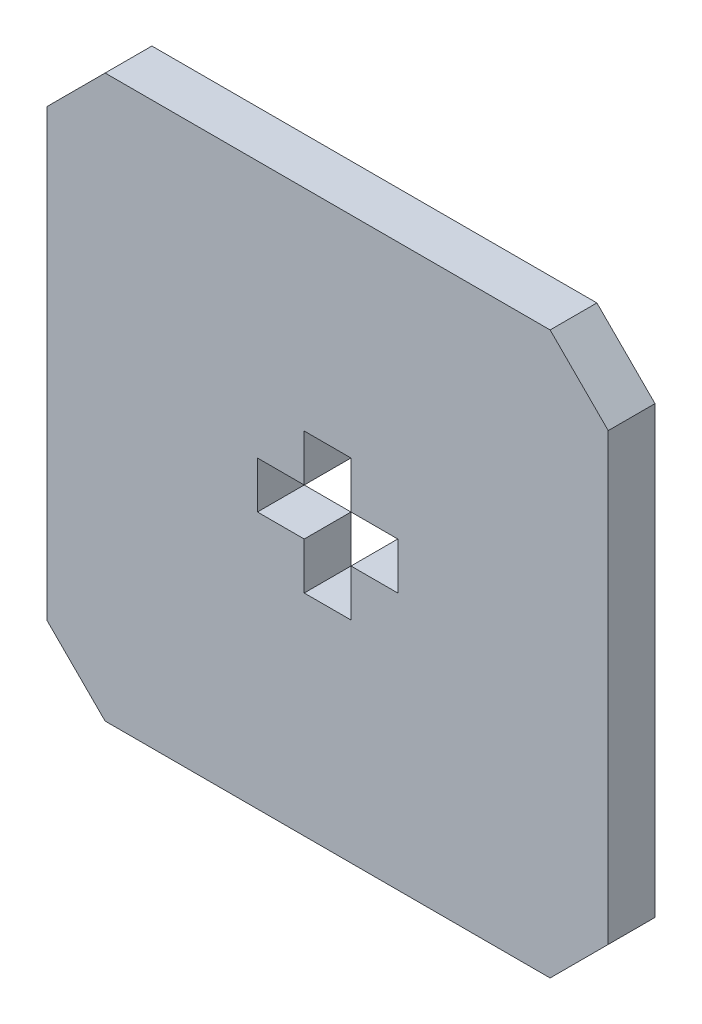
ISO-10303-21;
HEADER;
FILE_DESCRIPTION(('STEP AP214'),'2;1');
FILE_NAME('part.step','',(''),(''),'','','');
FILE_SCHEMA(('AUTOMOTIVE_DESIGN { 1 0 10303 214 1 1 1 1 }'));
ENDSEC;
DATA;
#1=APPLICATION_CONTEXT('core data for automotive mechanical design processes');
#2=APPLICATION_PROTOCOL_DEFINITION('international standard','automotive_design',2000,#1);
#3=PRODUCT_CONTEXT('',#1,'mechanical');
#4=PRODUCT('Part','Part','',(#3));
#5=PRODUCT_RELATED_PRODUCT_CATEGORY('part','',(#4));
#6=PRODUCT_DEFINITION_FORMATION('','',#4);
#7=PRODUCT_DEFINITION_CONTEXT('part definition',#1,'design');
#8=PRODUCT_DEFINITION('design','',#6,#7);
#9=PRODUCT_DEFINITION_SHAPE('','',#8);
#10=(LENGTH_UNIT() NAMED_UNIT(*) SI_UNIT(.MILLI.,.METRE.));
#11=(NAMED_UNIT(*) PLANE_ANGLE_UNIT() SI_UNIT($,.RADIAN.));
#12=(NAMED_UNIT(*) SI_UNIT($,.STERADIAN.) SOLID_ANGLE_UNIT());
#13=UNCERTAINTY_MEASURE_WITH_UNIT(LENGTH_MEASURE(1.E-05),#10,'distance_accuracy_value','');
#14=(GEOMETRIC_REPRESENTATION_CONTEXT(3) GLOBAL_UNCERTAINTY_ASSIGNED_CONTEXT((#13)) GLOBAL_UNIT_ASSIGNED_CONTEXT((#10,
#11,#12)) REPRESENTATION_CONTEXT('',''));
#15=CARTESIAN_POINT('',(0.,0.,0.));
#16=DIRECTION('',(0.,0.,1.));
#17=DIRECTION('',(1.,0.,0.));
#18=AXIS2_PLACEMENT_3D('',#15,#16,#17);
#19=CARTESIAN_POINT('',(0.,0.,3.));
#20=DIRECTION('',(0.,0.,1.));
#21=DIRECTION('',(1.,0.,0.));
#22=AXIS2_PLACEMENT_3D('',#19,#20,#21);
#23=PLANE('',#22);
#24=DIRECTION('',(0.,1.,0.));
#25=VECTOR('',#24,1.);
#26=CARTESIAN_POINT('',(471.000004860086,264.727917271616,3.));
#27=LINE('',#26,#25);
#28=CARTESIAN_POINT('',(471.000004860086,264.727917271616,3.));
#29=VERTEX_POINT('',#28);
#30=CARTESIAN_POINT('',(471.000004860086,293.272073148816,3.));
#31=VERTEX_POINT('',#30);
#32=EDGE_CURVE('E264',#29,#31,#27,.T.);
#33=ORIENTED_EDGE('',*,*,#32,.T.);
#34=DIRECTION('',(-0.707106781186548,0.707106781186548,0.));
#35=VECTOR('',#34,1.);
#36=CARTESIAN_POINT('',(471.000004860086,293.272073148816,3.));
#37=LINE('',#36,#35);
#38=CARTESIAN_POINT('',(467.272082798686,296.999995210216,3.));
#39=VERTEX_POINT('',#38);
#40=EDGE_CURVE('E267',#31,#39,#37,.T.);
#41=ORIENTED_EDGE('',*,*,#40,.T.);
#42=DIRECTION('',(-1.,0.,0.));
#43=VECTOR('',#42,1.);
#44=CARTESIAN_POINT('',(467.272082798686,296.999995210216,3.));
#45=LINE('',#44,#43);
#46=CARTESIAN_POINT('',(438.727926921486,296.999995210216,3.));
#47=VERTEX_POINT('',#46);
#48=EDGE_CURVE('E270',#39,#47,#45,.T.);
#49=ORIENTED_EDGE('',*,*,#48,.T.);
#50=DIRECTION('',(-0.707106781186548,-0.707106781186548,0.));
#51=VECTOR('',#50,1.);
#52=CARTESIAN_POINT('',(438.727926921486,296.999995210216,3.));
#53=LINE('',#52,#51);
#54=CARTESIAN_POINT('',(435.000004860086,293.272073148816,3.));
#55=VERTEX_POINT('',#54);
#56=EDGE_CURVE('E272',#47,#55,#53,.T.);
#57=ORIENTED_EDGE('',*,*,#56,.T.);
#58=DIRECTION('',(0.,-1.,0.));
#59=VECTOR('',#58,1.);
#60=CARTESIAN_POINT('',(435.000004860086,293.272073148816,3.));
#61=LINE('',#60,#59);
#62=CARTESIAN_POINT('',(435.000004860086,264.727917271616,3.));
#63=VERTEX_POINT('',#62);
#64=EDGE_CURVE('E274',#55,#63,#61,.T.);
#65=ORIENTED_EDGE('',*,*,#64,.T.);
#66=DIRECTION('',(0.707106781186548,-0.707106781186548,0.));
#67=VECTOR('',#66,1.);
#68=CARTESIAN_POINT('',(435.000004860086,264.727917271616,3.));
#69=LINE('',#68,#67);
#70=CARTESIAN_POINT('',(438.727926921486,260.999995210216,3.));
#71=VERTEX_POINT('',#70);
#72=EDGE_CURVE('E276',#63,#71,#69,.T.);
#73=ORIENTED_EDGE('',*,*,#72,.T.);
#74=DIRECTION('',(1.,0.,0.));
#75=VECTOR('',#74,1.);
#76=CARTESIAN_POINT('',(438.727926921486,260.999995210216,3.));
#77=LINE('',#76,#75);
#78=CARTESIAN_POINT('',(467.272082798686,260.999995210216,3.));
#79=VERTEX_POINT('',#78);
#80=EDGE_CURVE('E278',#71,#79,#77,.T.);
#81=ORIENTED_EDGE('',*,*,#80,.T.);
#82=DIRECTION('',(0.707106781186548,0.707106781186548,0.));
#83=VECTOR('',#82,1.);
#84=CARTESIAN_POINT('',(467.272082798686,260.999995210216,3.));
#85=LINE('',#84,#83);
#86=EDGE_CURVE('E280',#79,#29,#85,.T.);
#87=ORIENTED_EDGE('',*,*,#86,.T.);
#88=EDGE_LOOP('',(#33,#41,#49,#57,#65,#73,#81,#87));
#89=FACE_BOUND('',#88,.T.);
#90=DIRECTION('',(0.,1.,0.));
#91=VECTOR('',#90,1.);
#92=CARTESIAN_POINT('',(454.500004860086,274.499995210216,3.));
#93=LINE('',#92,#91);
#94=CARTESIAN_POINT('',(454.500004860086,274.499995210216,3.));
#95=VERTEX_POINT('',#94);
#96=CARTESIAN_POINT('',(454.500004860086,277.499995210216,3.));
#97=VERTEX_POINT('',#96);
#98=EDGE_CURVE('E179',#95,#97,#93,.T.);
#99=ORIENTED_EDGE('',*,*,#98,.F.);
#100=DIRECTION('',(1.,0.,0.));
#101=VECTOR('',#100,1.);
#102=CARTESIAN_POINT('',(451.500004860086,274.499995210216,3.));
#103=LINE('',#102,#101);
#104=CARTESIAN_POINT('',(451.500004860086,274.499995210216,3.));
#105=VERTEX_POINT('',#104);
#106=EDGE_CURVE('E171',#105,#95,#103,.T.);
#107=ORIENTED_EDGE('',*,*,#106,.F.);
#108=DIRECTION('',(0.,-1.,0.));
#109=VECTOR('',#108,1.);
#110=CARTESIAN_POINT('',(451.500004860086,277.499995210216,3.));
#111=LINE('',#110,#109);
#112=CARTESIAN_POINT('',(451.500004860086,277.499995210216,3.));
#113=VERTEX_POINT('',#112);
#114=EDGE_CURVE('E212',#113,#105,#111,.T.);
#115=ORIENTED_EDGE('',*,*,#114,.F.);
#116=DIRECTION('',(1.,0.,0.));
#117=VECTOR('',#116,1.);
#118=CARTESIAN_POINT('',(448.500004860086,277.499995210216,3.));
#119=LINE('',#118,#117);
#120=CARTESIAN_POINT('',(448.500004860086,277.499995210216,3.));
#121=VERTEX_POINT('',#120);
#122=EDGE_CURVE('E210',#121,#113,#119,.T.);
#123=ORIENTED_EDGE('',*,*,#122,.F.);
#124=DIRECTION('',(0.,-1.,0.));
#125=VECTOR('',#124,1.);
#126=CARTESIAN_POINT('',(448.500004860086,280.499995210216,3.));
#127=LINE('',#126,#125);
#128=CARTESIAN_POINT('',(448.500004860086,280.499995210216,3.));
#129=VERTEX_POINT('',#128);
#130=EDGE_CURVE('E208',#129,#121,#127,.T.);
#131=ORIENTED_EDGE('',*,*,#130,.F.);
#132=DIRECTION('',(-1.,0.,0.));
#133=VECTOR('',#132,1.);
#134=CARTESIAN_POINT('',(451.500004860086,280.499995210216,3.));
#135=LINE('',#134,#133);
#136=CARTESIAN_POINT('',(451.500004860086,280.499995210216,3.));
#137=VERTEX_POINT('',#136);
#138=EDGE_CURVE('E206',#137,#129,#135,.T.);
#139=ORIENTED_EDGE('',*,*,#138,.F.);
#140=DIRECTION('',(0.,-1.,0.));
#141=VECTOR('',#140,1.);
#142=CARTESIAN_POINT('',(451.500004860086,283.499995210216,3.));
#143=LINE('',#142,#141);
#144=CARTESIAN_POINT('',(451.500004860086,283.499995210216,3.));
#145=VERTEX_POINT('',#144);
#146=EDGE_CURVE('E204',#145,#137,#143,.T.);
#147=ORIENTED_EDGE('',*,*,#146,.F.);
#148=DIRECTION('',(-1.,0.,0.));
#149=VECTOR('',#148,1.);
#150=CARTESIAN_POINT('',(454.500004860086,283.499995210216,3.));
#151=LINE('',#150,#149);
#152=CARTESIAN_POINT('',(454.500004860086,283.499995210216,3.));
#153=VERTEX_POINT('',#152);
#154=EDGE_CURVE('E202',#153,#145,#151,.T.);
#155=ORIENTED_EDGE('',*,*,#154,.F.);
#156=DIRECTION('',(0.,1.,0.));
#157=VECTOR('',#156,1.);
#158=CARTESIAN_POINT('',(454.500004860086,280.499995210216,3.));
#159=LINE('',#158,#157);
#160=CARTESIAN_POINT('',(454.500004860086,280.499995210216,3.));
#161=VERTEX_POINT('',#160);
#162=EDGE_CURVE('E200',#161,#153,#159,.T.);
#163=ORIENTED_EDGE('',*,*,#162,.F.);
#164=DIRECTION('',(-1.,0.,0.));
#165=VECTOR('',#164,1.);
#166=CARTESIAN_POINT('',(457.500004860086,280.499995210216,3.));
#167=LINE('',#166,#165);
#168=CARTESIAN_POINT('',(457.500004860086,280.499995210216,3.));
#169=VERTEX_POINT('',#168);
#170=EDGE_CURVE('E198',#169,#161,#167,.T.);
#171=ORIENTED_EDGE('',*,*,#170,.F.);
#172=DIRECTION('',(0.,1.,0.));
#173=VECTOR('',#172,1.);
#174=CARTESIAN_POINT('',(457.500004860086,277.499995210216,3.));
#175=LINE('',#174,#173);
#176=CARTESIAN_POINT('',(457.500004860086,277.499995210216,3.));
#177=VERTEX_POINT('',#176);
#178=EDGE_CURVE('E194',#177,#169,#175,.T.);
#179=ORIENTED_EDGE('',*,*,#178,.F.);
#180=DIRECTION('',(1.,0.,0.));
#181=VECTOR('',#180,1.);
#182=CARTESIAN_POINT('',(454.500004860086,277.499995210216,3.));
#183=LINE('',#182,#181);
#184=EDGE_CURVE('E192',#97,#177,#183,.T.);
#185=ORIENTED_EDGE('',*,*,#184,.F.);
#186=EDGE_LOOP('',(#99,#107,#115,#123,#131,#139,#147,#155,#163,#171,#179,#185));
#187=FACE_BOUND('',#186,.T.);
#188=ADVANCED_FACE('F34',(#89,#187),#23,.T.);
#189=CARTESIAN_POINT('',(0.,0.,0.));
#190=DIRECTION('',(0.,0.,1.));
#191=DIRECTION('',(1.,0.,0.));
#192=AXIS2_PLACEMENT_3D('',#189,#190,#191);
#193=PLANE('',#192);
#194=DIRECTION('',(0.,1.,0.));
#195=VECTOR('',#194,1.);
#196=CARTESIAN_POINT('',(471.000004860086,264.727917271616,0.));
#197=LINE('',#196,#195);
#198=CARTESIAN_POINT('',(471.000004860086,264.727917271616,0.));
#199=VERTEX_POINT('',#198);
#200=CARTESIAN_POINT('',(471.000004860086,293.272073148816,0.));
#201=VERTEX_POINT('',#200);
#202=EDGE_CURVE('E187',#199,#201,#197,.T.);
#203=ORIENTED_EDGE('',*,*,#202,.F.);
#204=DIRECTION('',(0.707106781186548,0.707106781186548,0.));
#205=VECTOR('',#204,1.);
#206=CARTESIAN_POINT('',(467.272082798686,260.999995210216,0.));
#207=LINE('',#206,#205);
#208=CARTESIAN_POINT('',(467.272082798686,260.999995210216,0.));
#209=VERTEX_POINT('',#208);
#210=EDGE_CURVE('E268',#209,#199,#207,.T.);
#211=ORIENTED_EDGE('',*,*,#210,.F.);
#212=DIRECTION('',(1.,0.,0.));
#213=VECTOR('',#212,1.);
#214=CARTESIAN_POINT('',(438.727926921486,260.999995210216,0.));
#215=LINE('',#214,#213);
#216=CARTESIAN_POINT('',(438.727926921486,260.999995210216,0.));
#217=VERTEX_POINT('',#216);
#218=EDGE_CURVE('E295',#217,#209,#215,.T.);
#219=ORIENTED_EDGE('',*,*,#218,.F.);
#220=DIRECTION('',(0.707106781186548,-0.707106781186548,0.));
#221=VECTOR('',#220,1.);
#222=CARTESIAN_POINT('',(435.000004860086,264.727917271616,0.));
#223=LINE('',#222,#221);
#224=CARTESIAN_POINT('',(435.000004860086,264.727917271616,0.));
#225=VERTEX_POINT('',#224);
#226=EDGE_CURVE('E293',#225,#217,#223,.T.);
#227=ORIENTED_EDGE('',*,*,#226,.F.);
#228=DIRECTION('',(0.,-1.,0.));
#229=VECTOR('',#228,1.);
#230=CARTESIAN_POINT('',(435.000004860086,293.272073148816,0.));
#231=LINE('',#230,#229);
#232=CARTESIAN_POINT('',(435.000004860086,293.272073148816,0.));
#233=VERTEX_POINT('',#232);
#234=EDGE_CURVE('E291',#233,#225,#231,.T.);
#235=ORIENTED_EDGE('',*,*,#234,.F.);
#236=DIRECTION('',(-0.707106781186548,-0.707106781186548,0.));
#237=VECTOR('',#236,1.);
#238=CARTESIAN_POINT('',(438.727926921486,296.999995210216,0.));
#239=LINE('',#238,#237);
#240=CARTESIAN_POINT('',(438.727926921486,296.999995210216,0.));
#241=VERTEX_POINT('',#240);
#242=EDGE_CURVE('E289',#241,#233,#239,.T.);
#243=ORIENTED_EDGE('',*,*,#242,.F.);
#244=DIRECTION('',(-1.,0.,0.));
#245=VECTOR('',#244,1.);
#246=CARTESIAN_POINT('',(467.272082798686,296.999995210216,0.));
#247=LINE('',#246,#245);
#248=CARTESIAN_POINT('',(467.272082798686,296.999995210216,0.));
#249=VERTEX_POINT('',#248);
#250=EDGE_CURVE('E287',#249,#241,#247,.T.);
#251=ORIENTED_EDGE('',*,*,#250,.F.);
#252=DIRECTION('',(-0.707106781186548,0.707106781186548,0.));
#253=VECTOR('',#252,1.);
#254=CARTESIAN_POINT('',(471.000004860086,293.272073148816,0.));
#255=LINE('',#254,#253);
#256=EDGE_CURVE('E285',#201,#249,#255,.T.);
#257=ORIENTED_EDGE('',*,*,#256,.F.);
#258=EDGE_LOOP('',(#203,#211,#219,#227,#235,#243,#251,#257));
#259=FACE_BOUND('',#258,.T.);
#260=DIRECTION('',(1.,0.,0.));
#261=VECTOR('',#260,1.);
#262=CARTESIAN_POINT('',(451.500004860086,274.499995210216,0.));
#263=LINE('',#262,#261);
#264=CARTESIAN_POINT('',(451.500004860086,274.499995210216,0.));
#265=VERTEX_POINT('',#264);
#266=CARTESIAN_POINT('',(454.500004860086,274.499995210216,0.));
#267=VERTEX_POINT('',#266);
#268=EDGE_CURVE('E57',#265,#267,#263,.T.);
#269=ORIENTED_EDGE('',*,*,#268,.T.);
#270=DIRECTION('',(0.,1.,0.));
#271=VECTOR('',#270,1.);
#272=CARTESIAN_POINT('',(454.500004860086,274.499995210216,0.));
#273=LINE('',#272,#271);
#274=CARTESIAN_POINT('',(454.500004860086,277.499995210216,0.));
#275=VERTEX_POINT('',#274);
#276=EDGE_CURVE('E186',#267,#275,#273,.T.);
#277=ORIENTED_EDGE('',*,*,#276,.T.);
#278=DIRECTION('',(1.,0.,0.));
#279=VECTOR('',#278,1.);
#280=CARTESIAN_POINT('',(454.500004860086,277.499995210216,0.));
#281=LINE('',#280,#279);
#282=CARTESIAN_POINT('',(457.500004860086,277.499995210216,0.));
#283=VERTEX_POINT('',#282);
#284=EDGE_CURVE('E216',#275,#283,#281,.T.);
#285=ORIENTED_EDGE('',*,*,#284,.T.);
#286=DIRECTION('',(0.,1.,0.));
#287=VECTOR('',#286,1.);
#288=CARTESIAN_POINT('',(457.500004860086,277.499995210216,0.));
#289=LINE('',#288,#287);
#290=CARTESIAN_POINT('',(457.500004860086,280.499995210216,0.));
#291=VERTEX_POINT('',#290);
#292=EDGE_CURVE('E219',#283,#291,#289,.T.);
#293=ORIENTED_EDGE('',*,*,#292,.T.);
#294=DIRECTION('',(-1.,0.,0.));
#295=VECTOR('',#294,1.);
#296=CARTESIAN_POINT('',(457.500004860086,280.499995210216,0.));
#297=LINE('',#296,#295);
#298=CARTESIAN_POINT('',(454.500004860086,280.499995210216,0.));
#299=VERTEX_POINT('',#298);
#300=EDGE_CURVE('E222',#291,#299,#297,.T.);
#301=ORIENTED_EDGE('',*,*,#300,.T.);
#302=DIRECTION('',(0.,1.,0.));
#303=VECTOR('',#302,1.);
#304=CARTESIAN_POINT('',(454.500004860086,280.499995210216,0.));
#305=LINE('',#304,#303);
#306=CARTESIAN_POINT('',(454.500004860086,283.499995210216,0.));
#307=VERTEX_POINT('',#306);
#308=EDGE_CURVE('E225',#299,#307,#305,.T.);
#309=ORIENTED_EDGE('',*,*,#308,.T.);
#310=DIRECTION('',(-1.,0.,0.));
#311=VECTOR('',#310,1.);
#312=CARTESIAN_POINT('',(454.500004860086,283.499995210216,0.));
#313=LINE('',#312,#311);
#314=CARTESIAN_POINT('',(451.500004860086,283.499995210216,0.));
#315=VERTEX_POINT('',#314);
#316=EDGE_CURVE('E228',#307,#315,#313,.T.);
#317=ORIENTED_EDGE('',*,*,#316,.T.);
#318=DIRECTION('',(0.,-1.,0.));
#319=VECTOR('',#318,1.);
#320=CARTESIAN_POINT('',(451.500004860086,283.499995210216,0.));
#321=LINE('',#320,#319);
#322=CARTESIAN_POINT('',(451.500004860086,280.499995210216,0.));
#323=VERTEX_POINT('',#322);
#324=EDGE_CURVE('E231',#315,#323,#321,.T.);
#325=ORIENTED_EDGE('',*,*,#324,.T.);
#326=DIRECTION('',(-1.,0.,0.));
#327=VECTOR('',#326,1.);
#328=CARTESIAN_POINT('',(451.500004860086,280.499995210216,0.));
#329=LINE('',#328,#327);
#330=CARTESIAN_POINT('',(448.500004860086,280.499995210216,0.));
#331=VERTEX_POINT('',#330);
#332=EDGE_CURVE('E234',#323,#331,#329,.T.);
#333=ORIENTED_EDGE('',*,*,#332,.T.);
#334=DIRECTION('',(0.,-1.,0.));
#335=VECTOR('',#334,1.);
#336=CARTESIAN_POINT('',(448.500004860086,280.499995210216,0.));
#337=LINE('',#336,#335);
#338=CARTESIAN_POINT('',(448.500004860086,277.499995210216,0.));
#339=VERTEX_POINT('',#338);
#340=EDGE_CURVE('E237',#331,#339,#337,.T.);
#341=ORIENTED_EDGE('',*,*,#340,.T.);
#342=DIRECTION('',(1.,0.,0.));
#343=VECTOR('',#342,1.);
#344=CARTESIAN_POINT('',(448.500004860086,277.499995210216,0.));
#345=LINE('',#344,#343);
#346=CARTESIAN_POINT('',(451.500004860086,277.499995210216,0.));
#347=VERTEX_POINT('',#346);
#348=EDGE_CURVE('E240',#339,#347,#345,.T.);
#349=ORIENTED_EDGE('',*,*,#348,.T.);
#350=DIRECTION('',(0.,-1.,0.));
#351=VECTOR('',#350,1.);
#352=CARTESIAN_POINT('',(451.500004860086,277.499995210216,0.));
#353=LINE('',#352,#351);
#354=EDGE_CURVE('E180',#347,#265,#353,.T.);
#355=ORIENTED_EDGE('',*,*,#354,.T.);
#356=EDGE_LOOP('',(#269,#277,#285,#293,#301,#309,#317,#325,#333,#341,#349,#355));
#357=FACE_BOUND('',#356,.T.);
#358=ADVANCED_FACE('F325',(#259,#357),#193,.F.);
#359=CARTESIAN_POINT('',(471.000004860086,264.727917271616,3.));
#360=DIRECTION('',(-1.,0.,0.));
#361=DIRECTION('',(0.,0.,1.));
#362=AXIS2_PLACEMENT_3D('',#359,#360,#361);
#363=PLANE('',#362);
#364=ORIENTED_EDGE('',*,*,#202,.T.);
#365=DIRECTION('',(0.,0.,-1.));
#366=VECTOR('',#365,1.);
#367=CARTESIAN_POINT('',(471.000004860086,293.272073148816,3.));
#368=LINE('',#367,#366);
#369=EDGE_CURVE('E11',#31,#201,#368,.T.);
#370=ORIENTED_EDGE('',*,*,#369,.F.);
#371=ORIENTED_EDGE('',*,*,#32,.F.);
#372=DIRECTION('',(0.,0.,-1.));
#373=VECTOR('',#372,1.);
#374=CARTESIAN_POINT('',(471.000004860086,264.727917271616,3.));
#375=LINE('',#374,#373);
#376=EDGE_CURVE('E282',#29,#199,#375,.T.);
#377=ORIENTED_EDGE('',*,*,#376,.T.);
#378=EDGE_LOOP('',(#364,#370,#371,#377));
#379=FACE_BOUND('',#378,.T.);
#380=ADVANCED_FACE('F36',(#379),#363,.F.);
#381=CARTESIAN_POINT('',(471.000004860086,293.272073148816,3.));
#382=DIRECTION('',(-0.707106781186547,-0.707106781186547,0.));
#383=DIRECTION('',(0.707106781186548,-0.707106781186548,0.));
#384=AXIS2_PLACEMENT_3D('',#381,#382,#383);
#385=PLANE('',#384);
#386=ORIENTED_EDGE('',*,*,#256,.T.);
#387=DIRECTION('',(0.,0.,-1.));
#388=VECTOR('',#387,1.);
#389=CARTESIAN_POINT('',(467.272082798686,296.999995210216,3.));
#390=LINE('',#389,#388);
#391=EDGE_CURVE('E42',#39,#249,#390,.T.);
#392=ORIENTED_EDGE('',*,*,#391,.F.);
#393=ORIENTED_EDGE('',*,*,#40,.F.);
#394=ORIENTED_EDGE('',*,*,#369,.T.);
#395=EDGE_LOOP('',(#386,#392,#393,#394));
#396=FACE_BOUND('',#395,.T.);
#397=ADVANCED_FACE('F342',(#396),#385,.F.);
#398=CARTESIAN_POINT('',(467.272082798686,296.999995210216,3.));
#399=DIRECTION('',(0.,-1.,0.));
#400=DIRECTION('',(0.,0.,-1.));
#401=AXIS2_PLACEMENT_3D('',#398,#399,#400);
#402=PLANE('',#401);
#403=ORIENTED_EDGE('',*,*,#250,.T.);
#404=DIRECTION('',(0.,0.,-1.));
#405=VECTOR('',#404,1.);
#406=CARTESIAN_POINT('',(438.727926921486,296.999995210216,3.));
#407=LINE('',#406,#405);
#408=EDGE_CURVE('E312',#47,#241,#407,.T.);
#409=ORIENTED_EDGE('',*,*,#408,.F.);
#410=ORIENTED_EDGE('',*,*,#48,.F.);
#411=ORIENTED_EDGE('',*,*,#391,.T.);
#412=EDGE_LOOP('',(#403,#409,#410,#411));
#413=FACE_BOUND('',#412,.T.);
#414=ADVANCED_FACE('F319',(#413),#402,.F.);
#415=CARTESIAN_POINT('',(438.727926921486,296.999995210216,3.));
#416=DIRECTION('',(0.707106781186547,-0.707106781186547,0.));
#417=DIRECTION('',(0.707106781186548,0.707106781186548,0.));
#418=AXIS2_PLACEMENT_3D('',#415,#416,#417);
#419=PLANE('',#418);
#420=ORIENTED_EDGE('',*,*,#242,.T.);
#421=DIRECTION('',(0.,0.,-1.));
#422=VECTOR('',#421,1.);
#423=CARTESIAN_POINT('',(435.000004860086,293.272073148816,3.));
#424=LINE('',#423,#422);
#425=EDGE_CURVE('E309',#55,#233,#424,.T.);
#426=ORIENTED_EDGE('',*,*,#425,.F.);
#427=ORIENTED_EDGE('',*,*,#56,.F.);
#428=ORIENTED_EDGE('',*,*,#408,.T.);
#429=EDGE_LOOP('',(#420,#426,#427,#428));
#430=FACE_BOUND('',#429,.T.);
#431=ADVANCED_FACE('F331',(#430),#419,.F.);
#432=CARTESIAN_POINT('',(435.000004860086,293.272073148816,3.));
#433=DIRECTION('',(1.,0.,0.));
#434=DIRECTION('',(0.,0.,-1.));
#435=AXIS2_PLACEMENT_3D('',#432,#433,#434);
#436=PLANE('',#435);
#437=ORIENTED_EDGE('',*,*,#234,.T.);
#438=DIRECTION('',(0.,0.,-1.));
#439=VECTOR('',#438,1.);
#440=CARTESIAN_POINT('',(435.000004860086,264.727917271616,3.));
#441=LINE('',#440,#439);
#442=EDGE_CURVE('E306',#63,#225,#441,.T.);
#443=ORIENTED_EDGE('',*,*,#442,.F.);
#444=ORIENTED_EDGE('',*,*,#64,.F.);
#445=ORIENTED_EDGE('',*,*,#425,.T.);
#446=EDGE_LOOP('',(#437,#443,#444,#445));
#447=FACE_BOUND('',#446,.T.);
#448=ADVANCED_FACE('F335',(#447),#436,.F.);
#449=CARTESIAN_POINT('',(435.000004860086,264.727917271616,3.));
#450=DIRECTION('',(0.707106781186547,0.707106781186547,0.));
#451=DIRECTION('',(-0.707106781186548,0.707106781186548,0.));
#452=AXIS2_PLACEMENT_3D('',#449,#450,#451);
#453=PLANE('',#452);
#454=ORIENTED_EDGE('',*,*,#226,.T.);
#455=DIRECTION('',(0.,0.,-1.));
#456=VECTOR('',#455,1.);
#457=CARTESIAN_POINT('',(438.727926921486,260.999995210216,3.));
#458=LINE('',#457,#456);
#459=EDGE_CURVE('E303',#71,#217,#458,.T.);
#460=ORIENTED_EDGE('',*,*,#459,.F.);
#461=ORIENTED_EDGE('',*,*,#72,.F.);
#462=ORIENTED_EDGE('',*,*,#442,.T.);
#463=EDGE_LOOP('',(#454,#460,#461,#462));
#464=FACE_BOUND('',#463,.T.);
#465=ADVANCED_FACE('F355',(#464),#453,.F.);
#466=CARTESIAN_POINT('',(438.727926921486,260.999995210216,3.));
#467=DIRECTION('',(0.,1.,0.));
#468=DIRECTION('',(0.,0.,1.));
#469=AXIS2_PLACEMENT_3D('',#466,#467,#468);
#470=PLANE('',#469);
#471=ORIENTED_EDGE('',*,*,#218,.T.);
#472=DIRECTION('',(0.,0.,-1.));
#473=VECTOR('',#472,1.);
#474=CARTESIAN_POINT('',(467.272082798686,260.999995210216,3.));
#475=LINE('',#474,#473);
#476=EDGE_CURVE('E300',#79,#209,#475,.T.);
#477=ORIENTED_EDGE('',*,*,#476,.F.);
#478=ORIENTED_EDGE('',*,*,#80,.F.);
#479=ORIENTED_EDGE('',*,*,#459,.T.);
#480=EDGE_LOOP('',(#471,#477,#478,#479));
#481=FACE_BOUND('',#480,.T.);
#482=ADVANCED_FACE('F353',(#481),#470,.F.);
#483=CARTESIAN_POINT('',(467.272082798686,260.999995210216,3.));
#484=DIRECTION('',(-0.707106781186547,0.707106781186547,0.));
#485=DIRECTION('',(-0.707106781186548,-0.707106781186548,0.));
#486=AXIS2_PLACEMENT_3D('',#483,#484,#485);
#487=PLANE('',#486);
#488=ORIENTED_EDGE('',*,*,#210,.T.);
#489=ORIENTED_EDGE('',*,*,#376,.F.);
#490=ORIENTED_EDGE('',*,*,#86,.F.);
#491=ORIENTED_EDGE('',*,*,#476,.T.);
#492=EDGE_LOOP('',(#488,#489,#490,#491));
#493=FACE_BOUND('',#492,.T.);
#494=ADVANCED_FACE('F348',(#493),#487,.F.);
#495=CARTESIAN_POINT('',(451.500004860086,274.499995210216,3.));
#496=DIRECTION('',(0.,1.,0.));
#497=DIRECTION('',(0.,0.,1.));
#498=AXIS2_PLACEMENT_3D('',#495,#496,#497);
#499=PLANE('',#498);
#500=ORIENTED_EDGE('',*,*,#268,.F.);
#501=DIRECTION('',(0.,0.,-1.));
#502=VECTOR('',#501,1.);
#503=CARTESIAN_POINT('',(451.500004860086,274.499995210216,3.));
#504=LINE('',#503,#502);
#505=EDGE_CURVE('E175',#105,#265,#504,.T.);
#506=ORIENTED_EDGE('',*,*,#505,.F.);
#507=ORIENTED_EDGE('',*,*,#106,.T.);
#508=DIRECTION('',(0.,0.,-1.));
#509=VECTOR('',#508,1.);
#510=CARTESIAN_POINT('',(454.500004860086,274.499995210216,3.));
#511=LINE('',#510,#509);
#512=EDGE_CURVE('E174',#95,#267,#511,.T.);
#513=ORIENTED_EDGE('',*,*,#512,.T.);
#514=EDGE_LOOP('',(#500,#506,#507,#513));
#515=FACE_BOUND('',#514,.T.);
#516=ADVANCED_FACE('F173',(#515),#499,.T.);
#517=CARTESIAN_POINT('',(454.500004860086,274.499995210216,3.));
#518=DIRECTION('',(-1.,0.,0.));
#519=DIRECTION('',(0.,0.,1.));
#520=AXIS2_PLACEMENT_3D('',#517,#518,#519);
#521=PLANE('',#520);
#522=ORIENTED_EDGE('',*,*,#276,.F.);
#523=ORIENTED_EDGE('',*,*,#512,.F.);
#524=ORIENTED_EDGE('',*,*,#98,.T.);
#525=DIRECTION('',(0.,0.,-1.));
#526=VECTOR('',#525,1.);
#527=CARTESIAN_POINT('',(454.500004860086,277.499995210216,3.));
#528=LINE('',#527,#526);
#529=EDGE_CURVE('E188',#97,#275,#528,.T.);
#530=ORIENTED_EDGE('',*,*,#529,.T.);
#531=EDGE_LOOP('',(#522,#523,#524,#530));
#532=FACE_BOUND('',#531,.T.);
#533=ADVANCED_FACE('F183',(#532),#521,.T.);
#534=CARTESIAN_POINT('',(454.500004860086,277.499995210216,3.));
#535=DIRECTION('',(0.,1.,0.));
#536=DIRECTION('',(0.,0.,1.));
#537=AXIS2_PLACEMENT_3D('',#534,#535,#536);
#538=PLANE('',#537);
#539=ORIENTED_EDGE('',*,*,#284,.F.);
#540=ORIENTED_EDGE('',*,*,#529,.F.);
#541=ORIENTED_EDGE('',*,*,#184,.T.);
#542=DIRECTION('',(0.,0.,-1.));
#543=VECTOR('',#542,1.);
#544=CARTESIAN_POINT('',(457.500004860086,277.499995210216,3.));
#545=LINE('',#544,#543);
#546=EDGE_CURVE('E261',#177,#283,#545,.T.);
#547=ORIENTED_EDGE('',*,*,#546,.T.);
#548=EDGE_LOOP('',(#539,#540,#541,#547));
#549=FACE_BOUND('',#548,.T.);
#550=ADVANCED_FACE('F380',(#549),#538,.T.);
#551=CARTESIAN_POINT('',(457.500004860086,277.499995210216,3.));
#552=DIRECTION('',(-1.,0.,0.));
#553=DIRECTION('',(0.,0.,1.));
#554=AXIS2_PLACEMENT_3D('',#551,#552,#553);
#555=PLANE('',#554);
#556=ORIENTED_EDGE('',*,*,#292,.F.);
#557=ORIENTED_EDGE('',*,*,#546,.F.);
#558=ORIENTED_EDGE('',*,*,#178,.T.);
#559=DIRECTION('',(0.,0.,-1.));
#560=VECTOR('',#559,1.);
#561=CARTESIAN_POINT('',(457.500004860086,280.499995210216,3.));
#562=LINE('',#561,#560);
#563=EDGE_CURVE('E259',#169,#291,#562,.T.);
#564=ORIENTED_EDGE('',*,*,#563,.T.);
#565=EDGE_LOOP('',(#556,#557,#558,#564));
#566=FACE_BOUND('',#565,.T.);
#567=ADVANCED_FACE('F384',(#566),#555,.T.);
#568=CARTESIAN_POINT('',(457.500004860086,280.499995210216,3.));
#569=DIRECTION('',(0.,-1.,0.));
#570=DIRECTION('',(0.,0.,-1.));
#571=AXIS2_PLACEMENT_3D('',#568,#569,#570);
#572=PLANE('',#571);
#573=ORIENTED_EDGE('',*,*,#300,.F.);
#574=ORIENTED_EDGE('',*,*,#563,.F.);
#575=ORIENTED_EDGE('',*,*,#170,.T.);
#576=DIRECTION('',(0.,0.,-1.));
#577=VECTOR('',#576,1.);
#578=CARTESIAN_POINT('',(454.500004860086,280.499995210216,3.));
#579=LINE('',#578,#577);
#580=EDGE_CURVE('E257',#161,#299,#579,.T.);
#581=ORIENTED_EDGE('',*,*,#580,.T.);
#582=EDGE_LOOP('',(#573,#574,#575,#581));
#583=FACE_BOUND('',#582,.T.);
#584=ADVANCED_FACE('F390',(#583),#572,.T.);
#585=CARTESIAN_POINT('',(454.500004860086,280.499995210216,3.));
#586=DIRECTION('',(-1.,0.,0.));
#587=DIRECTION('',(0.,0.,1.));
#588=AXIS2_PLACEMENT_3D('',#585,#586,#587);
#589=PLANE('',#588);
#590=ORIENTED_EDGE('',*,*,#308,.F.);
#591=ORIENTED_EDGE('',*,*,#580,.F.);
#592=ORIENTED_EDGE('',*,*,#162,.T.);
#593=DIRECTION('',(0.,0.,-1.));
#594=VECTOR('',#593,1.);
#595=CARTESIAN_POINT('',(454.500004860086,283.499995210216,3.));
#596=LINE('',#595,#594);
#597=EDGE_CURVE('E255',#153,#307,#596,.T.);
#598=ORIENTED_EDGE('',*,*,#597,.T.);
#599=EDGE_LOOP('',(#590,#591,#592,#598));
#600=FACE_BOUND('',#599,.T.);
#601=ADVANCED_FACE('F394',(#600),#589,.T.);
#602=CARTESIAN_POINT('',(454.500004860086,283.499995210216,3.));
#603=DIRECTION('',(0.,-1.,0.));
#604=DIRECTION('',(0.,0.,-1.));
#605=AXIS2_PLACEMENT_3D('',#602,#603,#604);
#606=PLANE('',#605);
#607=ORIENTED_EDGE('',*,*,#316,.F.);
#608=ORIENTED_EDGE('',*,*,#597,.F.);
#609=ORIENTED_EDGE('',*,*,#154,.T.);
#610=DIRECTION('',(0.,0.,-1.));
#611=VECTOR('',#610,1.);
#612=CARTESIAN_POINT('',(451.500004860086,283.499995210216,3.));
#613=LINE('',#612,#611);
#614=EDGE_CURVE('E253',#145,#315,#613,.T.);
#615=ORIENTED_EDGE('',*,*,#614,.T.);
#616=EDGE_LOOP('',(#607,#608,#609,#615));
#617=FACE_BOUND('',#616,.T.);
#618=ADVANCED_FACE('F398',(#617),#606,.T.);
#619=CARTESIAN_POINT('',(451.500004860086,283.499995210216,3.));
#620=DIRECTION('',(1.,0.,0.));
#621=DIRECTION('',(0.,0.,-1.));
#622=AXIS2_PLACEMENT_3D('',#619,#620,#621);
#623=PLANE('',#622);
#624=ORIENTED_EDGE('',*,*,#324,.F.);
#625=ORIENTED_EDGE('',*,*,#614,.F.);
#626=ORIENTED_EDGE('',*,*,#146,.T.);
#627=DIRECTION('',(0.,0.,-1.));
#628=VECTOR('',#627,1.);
#629=CARTESIAN_POINT('',(451.500004860086,280.499995210216,3.));
#630=LINE('',#629,#628);
#631=EDGE_CURVE('E251',#137,#323,#630,.T.);
#632=ORIENTED_EDGE('',*,*,#631,.T.);
#633=EDGE_LOOP('',(#624,#625,#626,#632));
#634=FACE_BOUND('',#633,.T.);
#635=ADVANCED_FACE('F402',(#634),#623,.T.);
#636=CARTESIAN_POINT('',(451.500004860086,280.499995210216,3.));
#637=DIRECTION('',(0.,-1.,0.));
#638=DIRECTION('',(0.,0.,-1.));
#639=AXIS2_PLACEMENT_3D('',#636,#637,#638);
#640=PLANE('',#639);
#641=ORIENTED_EDGE('',*,*,#332,.F.);
#642=ORIENTED_EDGE('',*,*,#631,.F.);
#643=ORIENTED_EDGE('',*,*,#138,.T.);
#644=DIRECTION('',(0.,0.,-1.));
#645=VECTOR('',#644,1.);
#646=CARTESIAN_POINT('',(448.500004860086,280.499995210216,3.));
#647=LINE('',#646,#645);
#648=EDGE_CURVE('E249',#129,#331,#647,.T.);
#649=ORIENTED_EDGE('',*,*,#648,.T.);
#650=EDGE_LOOP('',(#641,#642,#643,#649));
#651=FACE_BOUND('',#650,.T.);
#652=ADVANCED_FACE('F406',(#651),#640,.T.);
#653=CARTESIAN_POINT('',(448.500004860086,280.499995210216,3.));
#654=DIRECTION('',(1.,0.,0.));
#655=DIRECTION('',(0.,0.,-1.));
#656=AXIS2_PLACEMENT_3D('',#653,#654,#655);
#657=PLANE('',#656);
#658=ORIENTED_EDGE('',*,*,#340,.F.);
#659=ORIENTED_EDGE('',*,*,#648,.F.);
#660=ORIENTED_EDGE('',*,*,#130,.T.);
#661=DIRECTION('',(0.,0.,-1.));
#662=VECTOR('',#661,1.);
#663=CARTESIAN_POINT('',(448.500004860086,277.499995210216,3.));
#664=LINE('',#663,#662);
#665=EDGE_CURVE('E247',#121,#339,#664,.T.);
#666=ORIENTED_EDGE('',*,*,#665,.T.);
#667=EDGE_LOOP('',(#658,#659,#660,#666));
#668=FACE_BOUND('',#667,.T.);
#669=ADVANCED_FACE('F410',(#668),#657,.T.);
#670=CARTESIAN_POINT('',(448.500004860086,277.499995210216,3.));
#671=DIRECTION('',(0.,1.,0.));
#672=DIRECTION('',(0.,0.,1.));
#673=AXIS2_PLACEMENT_3D('',#670,#671,#672);
#674=PLANE('',#673);
#675=ORIENTED_EDGE('',*,*,#348,.F.);
#676=ORIENTED_EDGE('',*,*,#665,.F.);
#677=ORIENTED_EDGE('',*,*,#122,.T.);
#678=DIRECTION('',(0.,0.,-1.));
#679=VECTOR('',#678,1.);
#680=CARTESIAN_POINT('',(451.500004860086,277.499995210216,3.));
#681=LINE('',#680,#679);
#682=EDGE_CURVE('E49',#113,#347,#681,.T.);
#683=ORIENTED_EDGE('',*,*,#682,.T.);
#684=EDGE_LOOP('',(#675,#676,#677,#683));
#685=FACE_BOUND('',#684,.T.);
#686=ADVANCED_FACE('F414',(#685),#674,.T.);
#687=CARTESIAN_POINT('',(451.500004860086,277.499995210216,3.));
#688=DIRECTION('',(1.,0.,0.));
#689=DIRECTION('',(0.,0.,-1.));
#690=AXIS2_PLACEMENT_3D('',#687,#688,#689);
#691=PLANE('',#690);
#692=ORIENTED_EDGE('',*,*,#354,.F.);
#693=ORIENTED_EDGE('',*,*,#682,.F.);
#694=ORIENTED_EDGE('',*,*,#114,.T.);
#695=ORIENTED_EDGE('',*,*,#505,.T.);
#696=EDGE_LOOP('',(#692,#693,#694,#695));
#697=FACE_BOUND('',#696,.T.);
#698=ADVANCED_FACE('F418',(#697),#691,.T.);
#699=CLOSED_SHELL('',(#188,#358,#380,#397,#414,#431,#448,#465,#482,#494,#516,#533,#550,#567,
#584,#601,#618,#635,#652,#669,#686,#698));
#700=MANIFOLD_SOLID_BREP('B2',#699);
#701=ADVANCED_BREP_SHAPE_REPRESENTATION('',(#18,#700),#14);
#702=SHAPE_DEFINITION_REPRESENTATION(#9,#701);
ENDSEC;
END-ISO-10303-21;
